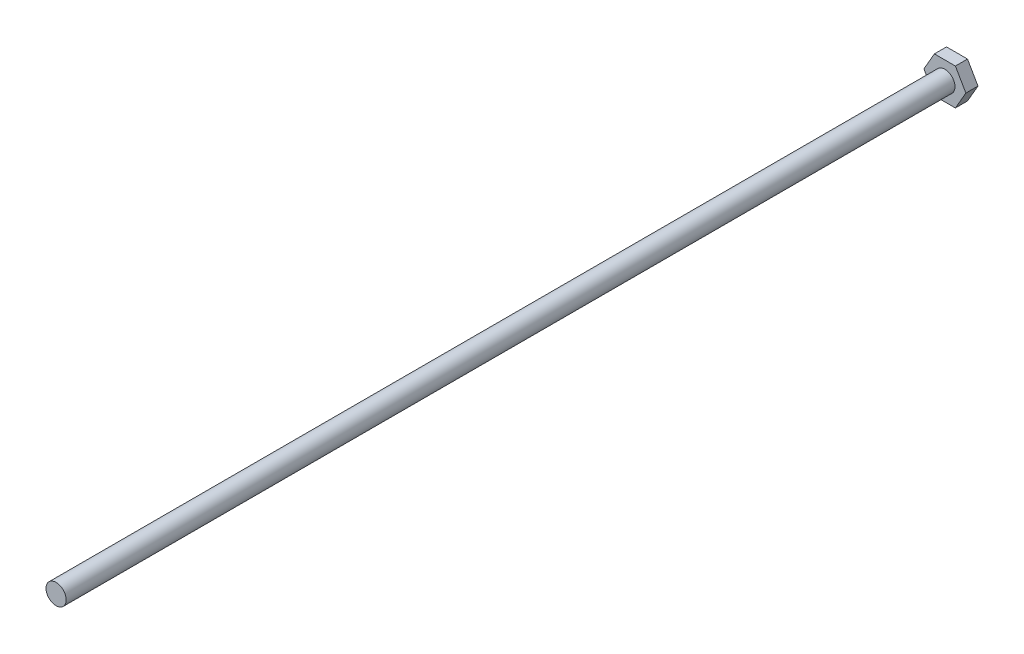
ISO-10303-21;
HEADER;
FILE_DESCRIPTION(('STEP AP214'),'2;1');
FILE_NAME('part.step','',(''),(''),'','','');
FILE_SCHEMA(('AUTOMOTIVE_DESIGN { 1 0 10303 214 1 1 1 1 }'));
ENDSEC;
DATA;
#1=APPLICATION_CONTEXT('core data for automotive mechanical design processes');
#2=APPLICATION_PROTOCOL_DEFINITION('international standard','automotive_design',2000,#1);
#3=PRODUCT_CONTEXT('',#1,'mechanical');
#4=PRODUCT('Part','Part','',(#3));
#5=PRODUCT_RELATED_PRODUCT_CATEGORY('part','',(#4));
#6=PRODUCT_DEFINITION_FORMATION('','',#4);
#7=PRODUCT_DEFINITION_CONTEXT('part definition',#1,'design');
#8=PRODUCT_DEFINITION('design','',#6,#7);
#9=PRODUCT_DEFINITION_SHAPE('','',#8);
#10=(LENGTH_UNIT() NAMED_UNIT(*) SI_UNIT(.MILLI.,.METRE.));
#11=(NAMED_UNIT(*) PLANE_ANGLE_UNIT() SI_UNIT($,.RADIAN.));
#12=(NAMED_UNIT(*) SI_UNIT($,.STERADIAN.) SOLID_ANGLE_UNIT());
#13=UNCERTAINTY_MEASURE_WITH_UNIT(LENGTH_MEASURE(1.E-05),#10,'distance_accuracy_value','');
#14=(GEOMETRIC_REPRESENTATION_CONTEXT(3) GLOBAL_UNCERTAINTY_ASSIGNED_CONTEXT((#13)) GLOBAL_UNIT_ASSIGNED_CONTEXT((#10,
#11,#12)) REPRESENTATION_CONTEXT('',''));
#15=CARTESIAN_POINT('',(0.,0.,0.));
#16=DIRECTION('',(0.,0.,1.));
#17=DIRECTION('',(1.,0.,0.));
#18=AXIS2_PLACEMENT_3D('',#15,#16,#17);
#19=CARTESIAN_POINT('',(0.,0.,220.));
#20=DIRECTION('',(0.,0.,-1.));
#21=DIRECTION('',(-1.,0.,0.));
#22=AXIS2_PLACEMENT_3D('',#19,#20,#21);
#23=CYLINDRICAL_SURFACE('',#22,2.5);
#24=CARTESIAN_POINT('',(0.,0.,220.));
#25=DIRECTION('',(0.,0.,1.));
#26=DIRECTION('',(1.,0.,0.));
#27=AXIS2_PLACEMENT_3D('',#24,#25,#26);
#28=CIRCLE('',#27,2.5);
#29=CARTESIAN_POINT('',(2.5,0.,220.));
#30=VERTEX_POINT('',#29);
#31=EDGE_CURVE('E11',#30,#30,#28,.T.);
#32=ORIENTED_EDGE('',*,*,#31,.F.);
#33=EDGE_LOOP('',(#32));
#34=FACE_BOUND('',#33,.T.);
#35=CARTESIAN_POINT('',(0.,0.,0.));
#36=DIRECTION('',(0.,0.,-1.));
#37=DIRECTION('',(-1.,0.,0.));
#38=AXIS2_PLACEMENT_3D('',#35,#36,#37);
#39=CIRCLE('',#38,2.5);
#40=CARTESIAN_POINT('',(-2.5,0.,0.));
#41=VERTEX_POINT('',#40);
#42=EDGE_CURVE('E44',#41,#41,#39,.T.);
#43=ORIENTED_EDGE('',*,*,#42,.F.);
#44=EDGE_LOOP('',(#43));
#45=FACE_BOUND('',#44,.T.);
#46=ADVANCED_FACE('F36',(#34,#45),#23,.T.);
#47=CARTESIAN_POINT('',(0.,0.,220.));
#48=DIRECTION('',(0.,0.,1.));
#49=DIRECTION('',(1.,0.,0.));
#50=AXIS2_PLACEMENT_3D('',#47,#48,#49);
#51=PLANE('',#50);
#52=ORIENTED_EDGE('',*,*,#31,.T.);
#53=EDGE_LOOP('',(#52));
#54=FACE_BOUND('',#53,.T.);
#55=ADVANCED_FACE('F145',(#54),#51,.T.);
#56=CARTESIAN_POINT('',(-7.79422863405994,4.5,0.));
#57=DIRECTION('',(0.,0.,-1.));
#58=DIRECTION('',(-1.,0.,0.));
#59=AXIS2_PLACEMENT_3D('',#56,#57,#58);
#60=PLANE('',#59);
#61=DIRECTION('',(-0.5,0.866025403784439,0.));
#62=VECTOR('',#61,1.);
#63=CARTESIAN_POINT('',(-2.59807621135332,-4.5,0.));
#64=LINE('',#63,#62);
#65=CARTESIAN_POINT('',(-2.59807621135332,-4.5,0.));
#66=VERTEX_POINT('',#65);
#67=CARTESIAN_POINT('',(-5.19615242270663,0.,0.));
#68=VERTEX_POINT('',#67);
#69=EDGE_CURVE('E121',#66,#68,#64,.T.);
#70=ORIENTED_EDGE('',*,*,#69,.F.);
#71=DIRECTION('',(-1.,0.,0.));
#72=VECTOR('',#71,1.);
#73=CARTESIAN_POINT('',(2.59807621135332,-4.5,0.));
#74=LINE('',#73,#72);
#75=CARTESIAN_POINT('',(2.59807621135332,-4.5,0.));
#76=VERTEX_POINT('',#75);
#77=EDGE_CURVE('E81',#76,#66,#74,.T.);
#78=ORIENTED_EDGE('',*,*,#77,.F.);
#79=DIRECTION('',(-0.5,-0.866025403784439,0.));
#80=VECTOR('',#79,1.);
#81=CARTESIAN_POINT('',(5.19615242270663,0.,0.));
#82=LINE('',#81,#80);
#83=CARTESIAN_POINT('',(5.19615242270663,0.,0.));
#84=VERTEX_POINT('',#83);
#85=EDGE_CURVE('E75',#84,#76,#82,.T.);
#86=ORIENTED_EDGE('',*,*,#85,.F.);
#87=DIRECTION('',(0.5,-0.866025403784439,0.));
#88=VECTOR('',#87,1.);
#89=CARTESIAN_POINT('',(2.59807621135332,4.5,0.));
#90=LINE('',#89,#88);
#91=CARTESIAN_POINT('',(2.59807621135332,4.5,0.));
#92=VERTEX_POINT('',#91);
#93=EDGE_CURVE('E111',#92,#84,#90,.T.);
#94=ORIENTED_EDGE('',*,*,#93,.F.);
#95=DIRECTION('',(1.,0.,0.));
#96=VECTOR('',#95,1.);
#97=CARTESIAN_POINT('',(-2.59807621135332,4.5,0.));
#98=LINE('',#97,#96);
#99=CARTESIAN_POINT('',(-2.59807621135332,4.5,0.));
#100=VERTEX_POINT('',#99);
#101=EDGE_CURVE('E126',#100,#92,#98,.T.);
#102=ORIENTED_EDGE('',*,*,#101,.F.);
#103=DIRECTION('',(0.5,0.866025403784438,0.));
#104=VECTOR('',#103,1.);
#105=CARTESIAN_POINT('',(-5.19615242270663,0.,0.));
#106=LINE('',#105,#104);
#107=EDGE_CURVE('E124',#68,#100,#106,.T.);
#108=ORIENTED_EDGE('',*,*,#107,.F.);
#109=EDGE_LOOP('',(#70,#78,#86,#94,#102,#108));
#110=FACE_BOUND('',#109,.T.);
#111=ORIENTED_EDGE('',*,*,#42,.T.);
#112=EDGE_LOOP('',(#111));
#113=FACE_BOUND('',#112,.T.);
#114=ADVANCED_FACE('F142',(#110,#113),#60,.F.);
#115=CARTESIAN_POINT('',(-2.59807621135332,-4.5,-3.));
#116=DIRECTION('',(0.866025403784439,0.5,0.));
#117=DIRECTION('',(-0.5,0.866025403784439,0.));
#118=AXIS2_PLACEMENT_3D('',#115,#116,#117);
#119=PLANE('',#118);
#120=ORIENTED_EDGE('',*,*,#69,.T.);
#121=DIRECTION('',(0.,0.,1.));
#122=VECTOR('',#121,1.);
#123=CARTESIAN_POINT('',(-5.19615242270663,0.,-3.));
#124=LINE('',#123,#122);
#125=CARTESIAN_POINT('',(-5.19615242270663,0.,-3.));
#126=VERTEX_POINT('',#125);
#127=EDGE_CURVE('E138',#126,#68,#124,.T.);
#128=ORIENTED_EDGE('',*,*,#127,.F.);
#129=DIRECTION('',(-0.5,0.866025403784439,0.));
#130=VECTOR('',#129,1.);
#131=CARTESIAN_POINT('',(-2.59807621135332,-4.5,-3.));
#132=LINE('',#131,#130);
#133=CARTESIAN_POINT('',(-2.59807621135332,-4.5,-3.));
#134=VERTEX_POINT('',#133);
#135=EDGE_CURVE('E131',#134,#126,#132,.T.);
#136=ORIENTED_EDGE('',*,*,#135,.F.);
#137=DIRECTION('',(0.,0.,1.));
#138=VECTOR('',#137,1.);
#139=CARTESIAN_POINT('',(-2.59807621135332,-4.5,-3.));
#140=LINE('',#139,#138);
#141=EDGE_CURVE('E117',#134,#66,#140,.T.);
#142=ORIENTED_EDGE('',*,*,#141,.T.);
#143=EDGE_LOOP('',(#120,#128,#136,#142));
#144=FACE_BOUND('',#143,.T.);
#145=ADVANCED_FACE('F155',(#144),#119,.F.);
#146=CARTESIAN_POINT('',(-5.19615242270663,0.,-3.));
#147=DIRECTION('',(0.866025403784439,-0.5,0.));
#148=DIRECTION('',(0.5,0.866025403784439,0.));
#149=AXIS2_PLACEMENT_3D('',#146,#147,#148);
#150=PLANE('',#149);
#151=ORIENTED_EDGE('',*,*,#107,.T.);
#152=DIRECTION('',(0.,0.,1.));
#153=VECTOR('',#152,1.);
#154=CARTESIAN_POINT('',(-2.59807621135332,4.5,-3.));
#155=LINE('',#154,#153);
#156=CARTESIAN_POINT('',(-2.59807621135332,4.5,-3.));
#157=VERTEX_POINT('',#156);
#158=EDGE_CURVE('E135',#157,#100,#155,.T.);
#159=ORIENTED_EDGE('',*,*,#158,.F.);
#160=DIRECTION('',(0.5,0.866025403784438,0.));
#161=VECTOR('',#160,1.);
#162=CARTESIAN_POINT('',(-5.19615242270663,0.,-3.));
#163=LINE('',#162,#161);
#164=EDGE_CURVE('E90',#126,#157,#163,.T.);
#165=ORIENTED_EDGE('',*,*,#164,.F.);
#166=ORIENTED_EDGE('',*,*,#127,.T.);
#167=EDGE_LOOP('',(#151,#159,#165,#166));
#168=FACE_BOUND('',#167,.T.);
#169=ADVANCED_FACE('F161',(#168),#150,.F.);
#170=CARTESIAN_POINT('',(-2.59807621135332,4.5,-3.));
#171=DIRECTION('',(0.,-1.,0.));
#172=DIRECTION('',(0.,0.,-1.));
#173=AXIS2_PLACEMENT_3D('',#170,#171,#172);
#174=PLANE('',#173);
#175=ORIENTED_EDGE('',*,*,#101,.T.);
#176=DIRECTION('',(0.,0.,1.));
#177=VECTOR('',#176,1.);
#178=CARTESIAN_POINT('',(2.59807621135332,4.5,-3.));
#179=LINE('',#178,#177);
#180=CARTESIAN_POINT('',(2.59807621135332,4.5,-3.));
#181=VERTEX_POINT('',#180);
#182=EDGE_CURVE('E112',#181,#92,#179,.T.);
#183=ORIENTED_EDGE('',*,*,#182,.F.);
#184=DIRECTION('',(1.,0.,0.));
#185=VECTOR('',#184,1.);
#186=CARTESIAN_POINT('',(-2.59807621135332,4.5,-3.));
#187=LINE('',#186,#185);
#188=EDGE_CURVE('E103',#157,#181,#187,.T.);
#189=ORIENTED_EDGE('',*,*,#188,.F.);
#190=ORIENTED_EDGE('',*,*,#158,.T.);
#191=EDGE_LOOP('',(#175,#183,#189,#190));
#192=FACE_BOUND('',#191,.T.);
#193=ADVANCED_FACE('F165',(#192),#174,.F.);
#194=CARTESIAN_POINT('',(2.59807621135332,4.5,-3.));
#195=DIRECTION('',(-0.866025403784439,-0.5,0.));
#196=DIRECTION('',(0.5,-0.866025403784439,0.));
#197=AXIS2_PLACEMENT_3D('',#194,#195,#196);
#198=PLANE('',#197);
#199=ORIENTED_EDGE('',*,*,#93,.T.);
#200=DIRECTION('',(0.,0.,1.));
#201=VECTOR('',#200,1.);
#202=CARTESIAN_POINT('',(5.19615242270663,0.,-3.));
#203=LINE('',#202,#201);
#204=CARTESIAN_POINT('',(5.19615242270663,0.,-3.));
#205=VERTEX_POINT('',#204);
#206=EDGE_CURVE('E108',#205,#84,#203,.T.);
#207=ORIENTED_EDGE('',*,*,#206,.F.);
#208=DIRECTION('',(0.5,-0.866025403784439,0.));
#209=VECTOR('',#208,1.);
#210=CARTESIAN_POINT('',(2.59807621135332,4.5,-3.));
#211=LINE('',#210,#209);
#212=EDGE_CURVE('E97',#181,#205,#211,.T.);
#213=ORIENTED_EDGE('',*,*,#212,.F.);
#214=ORIENTED_EDGE('',*,*,#182,.T.);
#215=EDGE_LOOP('',(#199,#207,#213,#214));
#216=FACE_BOUND('',#215,.T.);
#217=ADVANCED_FACE('F109',(#216),#198,.F.);
#218=CARTESIAN_POINT('',(5.19615242270663,0.,-3.));
#219=DIRECTION('',(-0.866025403784439,0.5,0.));
#220=DIRECTION('',(-0.5,-0.866025403784439,0.));
#221=AXIS2_PLACEMENT_3D('',#218,#219,#220);
#222=PLANE('',#221);
#223=ORIENTED_EDGE('',*,*,#85,.T.);
#224=DIRECTION('',(0.,0.,1.));
#225=VECTOR('',#224,1.);
#226=CARTESIAN_POINT('',(2.59807621135332,-4.5,-3.));
#227=LINE('',#226,#225);
#228=CARTESIAN_POINT('',(2.59807621135332,-4.5,-3.));
#229=VERTEX_POINT('',#228);
#230=EDGE_CURVE('E113',#229,#76,#227,.T.);
#231=ORIENTED_EDGE('',*,*,#230,.F.);
#232=DIRECTION('',(-0.5,-0.866025403784439,0.));
#233=VECTOR('',#232,1.);
#234=CARTESIAN_POINT('',(5.19615242270663,0.,-3.));
#235=LINE('',#234,#233);
#236=EDGE_CURVE('E101',#205,#229,#235,.T.);
#237=ORIENTED_EDGE('',*,*,#236,.F.);
#238=ORIENTED_EDGE('',*,*,#206,.T.);
#239=EDGE_LOOP('',(#223,#231,#237,#238));
#240=FACE_BOUND('',#239,.T.);
#241=ADVANCED_FACE('F115',(#240),#222,.F.);
#242=CARTESIAN_POINT('',(2.59807621135332,-4.5,-3.));
#243=DIRECTION('',(0.,1.,0.));
#244=DIRECTION('',(0.,0.,1.));
#245=AXIS2_PLACEMENT_3D('',#242,#243,#244);
#246=PLANE('',#245);
#247=ORIENTED_EDGE('',*,*,#77,.T.);
#248=ORIENTED_EDGE('',*,*,#141,.F.);
#249=DIRECTION('',(-1.,0.,0.));
#250=VECTOR('',#249,1.);
#251=CARTESIAN_POINT('',(2.59807621135332,-4.5,-3.));
#252=LINE('',#251,#250);
#253=EDGE_CURVE('E52',#229,#134,#252,.T.);
#254=ORIENTED_EDGE('',*,*,#253,.F.);
#255=ORIENTED_EDGE('',*,*,#230,.T.);
#256=EDGE_LOOP('',(#247,#248,#254,#255));
#257=FACE_BOUND('',#256,.T.);
#258=ADVANCED_FACE('F173',(#257),#246,.F.);
#259=CARTESIAN_POINT('',(-7.79422863405994,4.5,-3.));
#260=DIRECTION('',(0.,0.,-1.));
#261=DIRECTION('',(-1.,0.,0.));
#262=AXIS2_PLACEMENT_3D('',#259,#260,#261);
#263=PLANE('',#262);
#264=ORIENTED_EDGE('',*,*,#135,.T.);
#265=ORIENTED_EDGE('',*,*,#164,.T.);
#266=ORIENTED_EDGE('',*,*,#188,.T.);
#267=ORIENTED_EDGE('',*,*,#212,.T.);
#268=ORIENTED_EDGE('',*,*,#236,.T.);
#269=ORIENTED_EDGE('',*,*,#253,.T.);
#270=EDGE_LOOP('',(#264,#265,#266,#267,#268,#269));
#271=FACE_BOUND('',#270,.T.);
#272=ADVANCED_FACE('F99',(#271),#263,.T.);
#273=CLOSED_SHELL('',(#46,#55,#114,#145,#169,#193,#217,#241,#258,#272));
#274=MANIFOLD_SOLID_BREP('B2',#273);
#275=ADVANCED_BREP_SHAPE_REPRESENTATION('',(#18,#274),#14);
#276=SHAPE_DEFINITION_REPRESENTATION(#9,#275);
ENDSEC;
END-ISO-10303-21;
